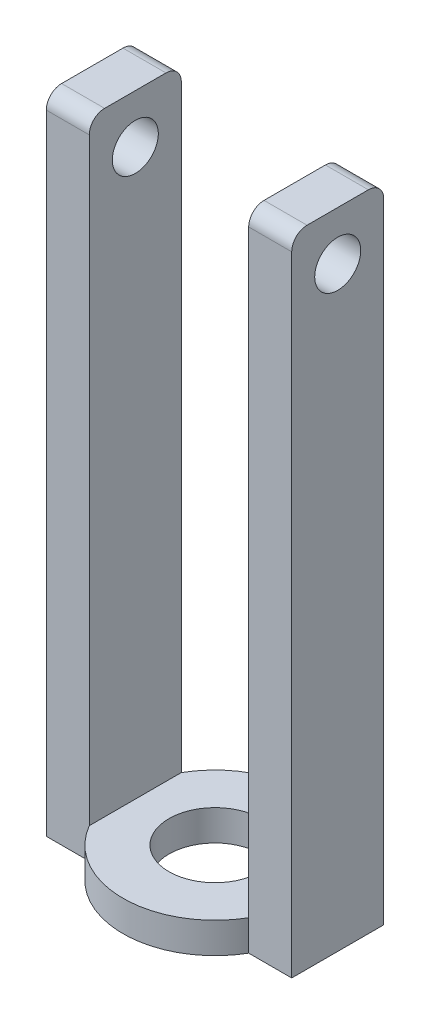
ISO-10303-21;
HEADER;
FILE_DESCRIPTION(('STEP AP214'),'2;1');
FILE_NAME('part.step','',(''),(''),'','','');
FILE_SCHEMA(('AUTOMOTIVE_DESIGN { 1 0 10303 214 1 1 1 1 }'));
ENDSEC;
DATA;
#1=APPLICATION_CONTEXT('core data for automotive mechanical design processes');
#2=APPLICATION_PROTOCOL_DEFINITION('international standard','automotive_design',2000,#1);
#3=PRODUCT_CONTEXT('',#1,'mechanical');
#4=PRODUCT('Part','Part','',(#3));
#5=PRODUCT_RELATED_PRODUCT_CATEGORY('part','',(#4));
#6=PRODUCT_DEFINITION_FORMATION('','',#4);
#7=PRODUCT_DEFINITION_CONTEXT('part definition',#1,'design');
#8=PRODUCT_DEFINITION('design','',#6,#7);
#9=PRODUCT_DEFINITION_SHAPE('','',#8);
#10=(LENGTH_UNIT() NAMED_UNIT(*) SI_UNIT(.MILLI.,.METRE.));
#11=(NAMED_UNIT(*) PLANE_ANGLE_UNIT() SI_UNIT($,.RADIAN.));
#12=(NAMED_UNIT(*) SI_UNIT($,.STERADIAN.) SOLID_ANGLE_UNIT());
#13=UNCERTAINTY_MEASURE_WITH_UNIT(LENGTH_MEASURE(1.E-05),#10,'distance_accuracy_value','');
#14=(GEOMETRIC_REPRESENTATION_CONTEXT(3) GLOBAL_UNCERTAINTY_ASSIGNED_CONTEXT((#13)) GLOBAL_UNIT_ASSIGNED_CONTEXT((#10,
#11,#12)) REPRESENTATION_CONTEXT('',''));
#15=CARTESIAN_POINT('',(0.,0.,0.));
#16=DIRECTION('',(0.,0.,1.));
#17=DIRECTION('',(1.,0.,0.));
#18=AXIS2_PLACEMENT_3D('',#15,#16,#17);
#19=CARTESIAN_POINT('',(0.,100.,0.));
#20=DIRECTION('',(0.,1.,0.));
#21=DIRECTION('',(0.,0.,1.));
#22=AXIS2_PLACEMENT_3D('',#19,#20,#21);
#23=PLANE('',#22);
#24=CARTESIAN_POINT('',(0.,100.,0.));
#25=DIRECTION('',(0.,1.,0.));
#26=DIRECTION('',(0.,0.,1.));
#27=AXIS2_PLACEMENT_3D('',#24,#25,#26);
#28=CIRCLE('',#27,150.);
#29=CARTESIAN_POINT('',(0.,100.,150.));
#30=VERTEX_POINT('',#29);
#31=EDGE_CURVE('E350',#30,#30,#28,.T.);
#32=ORIENTED_EDGE('',*,*,#31,.F.);
#33=EDGE_LOOP('',(#32));
#34=FACE_BOUND('',#33,.T.);
#35=CARTESIAN_POINT('',(0.,100.,0.));
#36=DIRECTION('',(0.,1.,0.));
#37=DIRECTION('',(0.,0.,1.));
#38=AXIS2_PLACEMENT_3D('',#35,#36,#37);
#39=CIRCLE('',#38,300.);
#40=CARTESIAN_POINT('',(-259.807621135332,100.,150.));
#41=VERTEX_POINT('',#40);
#42=CARTESIAN_POINT('',(259.807621135332,100.,150.));
#43=VERTEX_POINT('',#42);
#44=EDGE_CURVE('E159',#41,#43,#39,.T.);
#45=ORIENTED_EDGE('',*,*,#44,.T.);
#46=DIRECTION('',(0.,0.,1.));
#47=VECTOR('',#46,1.);
#48=CARTESIAN_POINT('',(259.807621135332,100.,-150.));
#49=LINE('',#48,#47);
#50=CARTESIAN_POINT('',(259.807621135332,100.,-150.));
#51=VERTEX_POINT('',#50);
#52=EDGE_CURVE('E148',#51,#43,#49,.T.);
#53=ORIENTED_EDGE('',*,*,#52,.F.);
#54=CARTESIAN_POINT('',(0.,100.,0.));
#55=DIRECTION('',(0.,1.,0.));
#56=DIRECTION('',(0.,0.,1.));
#57=AXIS2_PLACEMENT_3D('',#54,#55,#56);
#58=CIRCLE('',#57,300.);
#59=CARTESIAN_POINT('',(-259.807621135332,100.,-150.));
#60=VERTEX_POINT('',#59);
#61=EDGE_CURVE('E165',#51,#60,#58,.T.);
#62=ORIENTED_EDGE('',*,*,#61,.T.);
#63=DIRECTION('',(0.,0.,1.));
#64=VECTOR('',#63,1.);
#65=CARTESIAN_POINT('',(-259.807621135332,100.,-150.));
#66=LINE('',#65,#64);
#67=EDGE_CURVE('E154',#60,#41,#66,.T.);
#68=ORIENTED_EDGE('',*,*,#67,.T.);
#69=EDGE_LOOP('',(#45,#53,#62,#68));
#70=FACE_BOUND('',#69,.T.);
#71=ADVANCED_FACE('F34',(#34,#70),#23,.T.);
#72=CARTESIAN_POINT('',(0.,100.,0.));
#73=DIRECTION('',(0.,-1.,0.));
#74=DIRECTION('',(0.,0.,-1.));
#75=AXIS2_PLACEMENT_3D('',#72,#73,#74);
#76=CYLINDRICAL_SURFACE('',#75,300.);
#77=CARTESIAN_POINT('',(0.,0.,0.));
#78=DIRECTION('',(0.,1.,0.));
#79=DIRECTION('',(0.,0.,1.));
#80=AXIS2_PLACEMENT_3D('',#77,#78,#79);
#81=CIRCLE('',#80,300.);
#82=CARTESIAN_POINT('',(259.807621135332,0.,-150.));
#83=VERTEX_POINT('',#82);
#84=CARTESIAN_POINT('',(-259.807621135332,0.,-150.));
#85=VERTEX_POINT('',#84);
#86=EDGE_CURVE('E321',#83,#85,#81,.T.);
#87=ORIENTED_EDGE('',*,*,#86,.T.);
#88=DIRECTION('',(0.,-1.,0.));
#89=VECTOR('',#88,1.);
#90=CARTESIAN_POINT('',(-259.807621135332,100.,-150.));
#91=LINE('',#90,#89);
#92=EDGE_CURVE('E182',#60,#85,#91,.T.);
#93=ORIENTED_EDGE('',*,*,#92,.F.);
#94=ORIENTED_EDGE('',*,*,#61,.F.);
#95=DIRECTION('',(0.,-1.,0.));
#96=VECTOR('',#95,1.);
#97=CARTESIAN_POINT('',(259.807621135332,100.,-150.));
#98=LINE('',#97,#96);
#99=EDGE_CURVE('E164',#51,#83,#98,.T.);
#100=ORIENTED_EDGE('',*,*,#99,.T.);
#101=EDGE_LOOP('',(#87,#93,#94,#100));
#102=FACE_BOUND('',#101,.T.);
#103=ADVANCED_FACE('F257',(#102),#76,.T.);
#104=CARTESIAN_POINT('',(0.,100.,-150.));
#105=DIRECTION('',(0.,0.,-1.));
#106=DIRECTION('',(-1.,0.,0.));
#107=AXIS2_PLACEMENT_3D('',#104,#105,#106);
#108=PLANE('',#107);
#109=DIRECTION('',(0.,-1.,0.));
#110=VECTOR('',#109,1.);
#111=CARTESIAN_POINT('',(-400.,100.,-150.));
#112=LINE('',#111,#110);
#113=CARTESIAN_POINT('',(-400.,2050.,-150.));
#114=VERTEX_POINT('',#113);
#115=CARTESIAN_POINT('',(-400.,0.,-150.));
#116=VERTEX_POINT('',#115);
#117=EDGE_CURVE('E180',#114,#116,#112,.T.);
#118=ORIENTED_EDGE('',*,*,#117,.F.);
#119=DIRECTION('',(1.,0.,0.));
#120=VECTOR('',#119,1.);
#121=CARTESIAN_POINT('',(-259.807621135332,2050.,-150.));
#122=LINE('',#121,#120);
#123=CARTESIAN_POINT('',(-259.807621135332,2050.,-150.));
#124=VERTEX_POINT('',#123);
#125=EDGE_CURVE('E199',#114,#124,#122,.T.);
#126=ORIENTED_EDGE('',*,*,#125,.T.);
#127=DIRECTION('',(0.,-1.,0.));
#128=VECTOR('',#127,1.);
#129=CARTESIAN_POINT('',(-259.807621135332,2100.,-150.));
#130=LINE('',#129,#128);
#131=EDGE_CURVE('E340',#124,#60,#130,.T.);
#132=ORIENTED_EDGE('',*,*,#131,.T.);
#133=ORIENTED_EDGE('',*,*,#92,.T.);
#134=DIRECTION('',(1.,0.,0.));
#135=VECTOR('',#134,1.);
#136=CARTESIAN_POINT('',(0.,0.,-150.));
#137=LINE('',#136,#135);
#138=EDGE_CURVE('E317',#116,#85,#137,.T.);
#139=ORIENTED_EDGE('',*,*,#138,.F.);
#140=EDGE_LOOP('',(#118,#126,#132,#133,#139));
#141=FACE_BOUND('',#140,.T.);
#142=ADVANCED_FACE('F263',(#141),#108,.T.);
#143=CARTESIAN_POINT('',(-400.,100.,0.));
#144=DIRECTION('',(1.,0.,0.));
#145=DIRECTION('',(0.,0.,-1.));
#146=AXIS2_PLACEMENT_3D('',#143,#144,#145);
#147=PLANE('',#146);
#148=CARTESIAN_POINT('',(-400.,1941.16,0.));
#149=DIRECTION('',(-1.,0.,0.));
#150=DIRECTION('',(0.,0.,1.));
#151=AXIS2_PLACEMENT_3D('',#148,#149,#150);
#152=CIRCLE('',#151,75.);
#153=CARTESIAN_POINT('',(-400.,1941.16,75.));
#154=VERTEX_POINT('',#153);
#155=EDGE_CURVE('E358',#154,#154,#152,.T.);
#156=ORIENTED_EDGE('',*,*,#155,.F.);
#157=EDGE_LOOP('',(#156));
#158=FACE_BOUND('',#157,.T.);
#159=DIRECTION('',(0.,-1.,0.));
#160=VECTOR('',#159,1.);
#161=CARTESIAN_POINT('',(-400.,100.,150.));
#162=LINE('',#161,#160);
#163=CARTESIAN_POINT('',(-400.,2050.,150.));
#164=VERTEX_POINT('',#163);
#165=CARTESIAN_POINT('',(-400.,0.,150.));
#166=VERTEX_POINT('',#165);
#167=EDGE_CURVE('E173',#164,#166,#162,.T.);
#168=ORIENTED_EDGE('',*,*,#167,.F.);
#169=CARTESIAN_POINT('',(-400.,2050.,100.));
#170=DIRECTION('',(1.,0.,0.));
#171=DIRECTION('',(0.,0.,-1.));
#172=AXIS2_PLACEMENT_3D('',#169,#170,#171);
#173=CIRCLE('',#172,50.);
#174=CARTESIAN_POINT('',(-400.,2100.,100.));
#175=VERTEX_POINT('',#174);
#176=EDGE_CURVE('E197',#164,#175,#173,.F.);
#177=ORIENTED_EDGE('',*,*,#176,.T.);
#178=DIRECTION('',(0.,0.,1.));
#179=VECTOR('',#178,1.);
#180=CARTESIAN_POINT('',(-400.,2100.,-150.));
#181=LINE('',#180,#179);
#182=CARTESIAN_POINT('',(-400.,2100.,-100.));
#183=VERTEX_POINT('',#182);
#184=EDGE_CURVE('E313',#183,#175,#181,.T.);
#185=ORIENTED_EDGE('',*,*,#184,.F.);
#186=CARTESIAN_POINT('',(-400.,2050.,-100.));
#187=DIRECTION('',(1.,0.,0.));
#188=DIRECTION('',(0.,0.,-1.));
#189=AXIS2_PLACEMENT_3D('',#186,#187,#188);
#190=CIRCLE('',#189,50.);
#191=EDGE_CURVE('E195',#183,#114,#190,.F.);
#192=ORIENTED_EDGE('',*,*,#191,.T.);
#193=ORIENTED_EDGE('',*,*,#117,.T.);
#194=DIRECTION('',(0.,0.,1.));
#195=VECTOR('',#194,1.);
#196=CARTESIAN_POINT('',(-400.,0.,0.));
#197=LINE('',#196,#195);
#198=EDGE_CURVE('E320',#116,#166,#197,.T.);
#199=ORIENTED_EDGE('',*,*,#198,.T.);
#200=EDGE_LOOP('',(#168,#177,#185,#192,#193,#199));
#201=FACE_BOUND('',#200,.T.);
#202=ADVANCED_FACE('F286',(#158,#201),#147,.F.);
#203=CARTESIAN_POINT('',(0.,100.,150.));
#204=DIRECTION('',(0.,0.,-1.));
#205=DIRECTION('',(-1.,0.,0.));
#206=AXIS2_PLACEMENT_3D('',#203,#204,#205);
#207=PLANE('',#206);
#208=DIRECTION('',(0.,-1.,0.));
#209=VECTOR('',#208,1.);
#210=CARTESIAN_POINT('',(-259.807621135332,2100.,150.));
#211=LINE('',#210,#209);
#212=CARTESIAN_POINT('',(-259.807621135332,2050.,150.));
#213=VERTEX_POINT('',#212);
#214=EDGE_CURVE('E325',#213,#41,#211,.T.);
#215=ORIENTED_EDGE('',*,*,#214,.F.);
#216=DIRECTION('',(1.,0.,0.));
#217=VECTOR('',#216,1.);
#218=CARTESIAN_POINT('',(0.,2050.,150.));
#219=LINE('',#218,#217);
#220=EDGE_CURVE('E193',#213,#164,#219,.F.);
#221=ORIENTED_EDGE('',*,*,#220,.T.);
#222=ORIENTED_EDGE('',*,*,#167,.T.);
#223=DIRECTION('',(1.,0.,0.));
#224=VECTOR('',#223,1.);
#225=CARTESIAN_POINT('',(0.,0.,150.));
#226=LINE('',#225,#224);
#227=CARTESIAN_POINT('',(-259.807621135332,0.,150.));
#228=VERTEX_POINT('',#227);
#229=EDGE_CURVE('E323',#166,#228,#226,.T.);
#230=ORIENTED_EDGE('',*,*,#229,.T.);
#231=DIRECTION('',(0.,-1.,0.));
#232=VECTOR('',#231,1.);
#233=CARTESIAN_POINT('',(-259.807621135332,100.,150.));
#234=LINE('',#233,#232);
#235=EDGE_CURVE('E170',#41,#228,#234,.T.);
#236=ORIENTED_EDGE('',*,*,#235,.F.);
#237=EDGE_LOOP('',(#215,#221,#222,#230,#236));
#238=FACE_BOUND('',#237,.T.);
#239=ADVANCED_FACE('F283',(#238),#207,.F.);
#240=CARTESIAN_POINT('',(0.,100.,0.));
#241=DIRECTION('',(0.,-1.,0.));
#242=DIRECTION('',(0.,0.,-1.));
#243=AXIS2_PLACEMENT_3D('',#240,#241,#242);
#244=CYLINDRICAL_SURFACE('',#243,300.);
#245=CARTESIAN_POINT('',(0.,0.,0.));
#246=DIRECTION('',(0.,1.,0.));
#247=DIRECTION('',(0.,0.,1.));
#248=AXIS2_PLACEMENT_3D('',#245,#246,#247);
#249=CIRCLE('',#248,300.);
#250=CARTESIAN_POINT('',(259.807621135332,0.,150.));
#251=VERTEX_POINT('',#250);
#252=EDGE_CURVE('E169',#228,#251,#249,.T.);
#253=ORIENTED_EDGE('',*,*,#252,.T.);
#254=DIRECTION('',(0.,-1.,0.));
#255=VECTOR('',#254,1.);
#256=CARTESIAN_POINT('',(259.807621135332,100.,150.));
#257=LINE('',#256,#255);
#258=EDGE_CURVE('E141',#43,#251,#257,.T.);
#259=ORIENTED_EDGE('',*,*,#258,.F.);
#260=ORIENTED_EDGE('',*,*,#44,.F.);
#261=ORIENTED_EDGE('',*,*,#235,.T.);
#262=EDGE_LOOP('',(#253,#259,#260,#261));
#263=FACE_BOUND('',#262,.T.);
#264=ADVANCED_FACE('F167',(#263),#244,.T.);
#265=CARTESIAN_POINT('',(0.,100.,150.));
#266=DIRECTION('',(0.,0.,-1.));
#267=DIRECTION('',(-1.,0.,0.));
#268=AXIS2_PLACEMENT_3D('',#265,#266,#267);
#269=PLANE('',#268);
#270=DIRECTION('',(0.,-1.,0.));
#271=VECTOR('',#270,1.);
#272=CARTESIAN_POINT('',(400.,100.,150.));
#273=LINE('',#272,#271);
#274=CARTESIAN_POINT('',(400.,2050.,150.));
#275=VERTEX_POINT('',#274);
#276=CARTESIAN_POINT('',(400.,0.,150.));
#277=VERTEX_POINT('',#276);
#278=EDGE_CURVE('E171',#275,#277,#273,.T.);
#279=ORIENTED_EDGE('',*,*,#278,.F.);
#280=DIRECTION('',(1.,0.,0.));
#281=VECTOR('',#280,1.);
#282=CARTESIAN_POINT('',(0.,2050.,150.));
#283=LINE('',#282,#281);
#284=CARTESIAN_POINT('',(259.807621135332,2050.,150.));
#285=VERTEX_POINT('',#284);
#286=EDGE_CURVE('E58',#275,#285,#283,.F.);
#287=ORIENTED_EDGE('',*,*,#286,.T.);
#288=DIRECTION('',(0.,-1.,0.));
#289=VECTOR('',#288,1.);
#290=CARTESIAN_POINT('',(259.807621135332,2100.,150.));
#291=LINE('',#290,#289);
#292=EDGE_CURVE('E136',#285,#43,#291,.T.);
#293=ORIENTED_EDGE('',*,*,#292,.T.);
#294=ORIENTED_EDGE('',*,*,#258,.T.);
#295=DIRECTION('',(1.,0.,0.));
#296=VECTOR('',#295,1.);
#297=CARTESIAN_POINT('',(0.,0.,150.));
#298=LINE('',#297,#296);
#299=EDGE_CURVE('E226',#251,#277,#298,.T.);
#300=ORIENTED_EDGE('',*,*,#299,.T.);
#301=EDGE_LOOP('',(#279,#287,#293,#294,#300));
#302=FACE_BOUND('',#301,.T.);
#303=ADVANCED_FACE('F138',(#302),#269,.F.);
#304=CARTESIAN_POINT('',(400.,100.,0.));
#305=DIRECTION('',(1.,0.,0.));
#306=DIRECTION('',(0.,0.,-1.));
#307=AXIS2_PLACEMENT_3D('',#304,#305,#306);
#308=PLANE('',#307);
#309=CARTESIAN_POINT('',(400.,1941.16,0.));
#310=DIRECTION('',(-1.,0.,0.));
#311=DIRECTION('',(0.,0.,1.));
#312=AXIS2_PLACEMENT_3D('',#309,#310,#311);
#313=CIRCLE('',#312,75.);
#314=CARTESIAN_POINT('',(400.,1941.16,75.));
#315=VERTEX_POINT('',#314);
#316=EDGE_CURVE('E361',#315,#315,#313,.T.);
#317=ORIENTED_EDGE('',*,*,#316,.T.);
#318=EDGE_LOOP('',(#317));
#319=FACE_BOUND('',#318,.T.);
#320=DIRECTION('',(0.,0.,1.));
#321=VECTOR('',#320,1.);
#322=CARTESIAN_POINT('',(400.,2100.,-150.));
#323=LINE('',#322,#321);
#324=CARTESIAN_POINT('',(400.,2100.,-100.));
#325=VERTEX_POINT('',#324);
#326=CARTESIAN_POINT('',(400.,2100.,100.));
#327=VERTEX_POINT('',#326);
#328=EDGE_CURVE('E155',#325,#327,#323,.T.);
#329=ORIENTED_EDGE('',*,*,#328,.T.);
#330=CARTESIAN_POINT('',(400.,2050.,100.));
#331=DIRECTION('',(1.,0.,0.));
#332=DIRECTION('',(0.,0.,-1.));
#333=AXIS2_PLACEMENT_3D('',#330,#331,#332);
#334=CIRCLE('',#333,50.);
#335=EDGE_CURVE('E209',#327,#275,#334,.T.);
#336=ORIENTED_EDGE('',*,*,#335,.T.);
#337=ORIENTED_EDGE('',*,*,#278,.T.);
#338=DIRECTION('',(0.,0.,1.));
#339=VECTOR('',#338,1.);
#340=CARTESIAN_POINT('',(400.,0.,0.));
#341=LINE('',#340,#339);
#342=CARTESIAN_POINT('',(400.,0.,-150.));
#343=VERTEX_POINT('',#342);
#344=EDGE_CURVE('E229',#343,#277,#341,.T.);
#345=ORIENTED_EDGE('',*,*,#344,.F.);
#346=DIRECTION('',(0.,-1.,0.));
#347=VECTOR('',#346,1.);
#348=CARTESIAN_POINT('',(400.,100.,-150.));
#349=LINE('',#348,#347);
#350=CARTESIAN_POINT('',(400.,2050.,-150.));
#351=VERTEX_POINT('',#350);
#352=EDGE_CURVE('E175',#351,#343,#349,.T.);
#353=ORIENTED_EDGE('',*,*,#352,.F.);
#354=CARTESIAN_POINT('',(400.,2050.,-100.));
#355=DIRECTION('',(1.,0.,0.));
#356=DIRECTION('',(0.,0.,-1.));
#357=AXIS2_PLACEMENT_3D('',#354,#355,#356);
#358=CIRCLE('',#357,50.);
#359=EDGE_CURVE('E207',#351,#325,#358,.T.);
#360=ORIENTED_EDGE('',*,*,#359,.T.);
#361=EDGE_LOOP('',(#329,#336,#337,#345,#353,#360));
#362=FACE_BOUND('',#361,.T.);
#363=ADVANCED_FACE('F224',(#319,#362),#308,.T.);
#364=CARTESIAN_POINT('',(0.,100.,-150.));
#365=DIRECTION('',(0.,0.,-1.));
#366=DIRECTION('',(-1.,0.,0.));
#367=AXIS2_PLACEMENT_3D('',#364,#365,#366);
#368=PLANE('',#367);
#369=DIRECTION('',(0.,-1.,0.));
#370=VECTOR('',#369,1.);
#371=CARTESIAN_POINT('',(259.807621135332,2100.,-150.));
#372=LINE('',#371,#370);
#373=CARTESIAN_POINT('',(259.807621135332,2050.,-150.));
#374=VERTEX_POINT('',#373);
#375=EDGE_CURVE('E145',#374,#51,#372,.T.);
#376=ORIENTED_EDGE('',*,*,#375,.F.);
#377=DIRECTION('',(1.,0.,0.));
#378=VECTOR('',#377,1.);
#379=CARTESIAN_POINT('',(400.,2050.,-150.));
#380=LINE('',#379,#378);
#381=EDGE_CURVE('E11',#374,#351,#380,.T.);
#382=ORIENTED_EDGE('',*,*,#381,.T.);
#383=ORIENTED_EDGE('',*,*,#352,.T.);
#384=DIRECTION('',(1.,0.,0.));
#385=VECTOR('',#384,1.);
#386=CARTESIAN_POINT('',(0.,0.,-150.));
#387=LINE('',#386,#385);
#388=EDGE_CURVE('E235',#83,#343,#387,.T.);
#389=ORIENTED_EDGE('',*,*,#388,.F.);
#390=ORIENTED_EDGE('',*,*,#99,.F.);
#391=EDGE_LOOP('',(#376,#382,#383,#389,#390));
#392=FACE_BOUND('',#391,.T.);
#393=ADVANCED_FACE('F242',(#392),#368,.T.);
#394=CARTESIAN_POINT('',(0.,0.,0.));
#395=DIRECTION('',(0.,1.,0.));
#396=DIRECTION('',(0.,0.,1.));
#397=AXIS2_PLACEMENT_3D('',#394,#395,#396);
#398=PLANE('',#397);
#399=CARTESIAN_POINT('',(0.,0.,0.));
#400=DIRECTION('',(0.,1.,0.));
#401=DIRECTION('',(0.,0.,1.));
#402=AXIS2_PLACEMENT_3D('',#399,#400,#401);
#403=CIRCLE('',#402,150.);
#404=CARTESIAN_POINT('',(0.,0.,150.));
#405=VERTEX_POINT('',#404);
#406=EDGE_CURVE('E347',#405,#405,#403,.T.);
#407=ORIENTED_EDGE('',*,*,#406,.T.);
#408=EDGE_LOOP('',(#407));
#409=FACE_BOUND('',#408,.T.);
#410=ORIENTED_EDGE('',*,*,#86,.F.);
#411=ORIENTED_EDGE('',*,*,#388,.T.);
#412=ORIENTED_EDGE('',*,*,#344,.T.);
#413=ORIENTED_EDGE('',*,*,#299,.F.);
#414=ORIENTED_EDGE('',*,*,#252,.F.);
#415=ORIENTED_EDGE('',*,*,#229,.F.);
#416=ORIENTED_EDGE('',*,*,#198,.F.);
#417=ORIENTED_EDGE('',*,*,#138,.T.);
#418=EDGE_LOOP('',(#410,#411,#412,#413,#414,#415,#416,#417));
#419=FACE_BOUND('',#418,.T.);
#420=ADVANCED_FACE('F233',(#409,#419),#398,.F.);
#421=CARTESIAN_POINT('',(-259.807621135332,2100.,-150.));
#422=DIRECTION('',(1.,0.,0.));
#423=DIRECTION('',(0.,0.,-1.));
#424=AXIS2_PLACEMENT_3D('',#421,#422,#423);
#425=PLANE('',#424);
#426=CARTESIAN_POINT('',(-259.807621135332,1941.16,0.));
#427=DIRECTION('',(1.,0.,0.));
#428=DIRECTION('',(0.,0.,-1.));
#429=AXIS2_PLACEMENT_3D('',#426,#427,#428);
#430=CIRCLE('',#429,75.);
#431=CARTESIAN_POINT('',(-259.807621135332,1941.16,75.));
#432=VERTEX_POINT('',#431);
#433=EDGE_CURVE('E354',#432,#432,#430,.T.);
#434=ORIENTED_EDGE('',*,*,#433,.F.);
#435=EDGE_LOOP('',(#434));
#436=FACE_BOUND('',#435,.T.);
#437=DIRECTION('',(0.,0.,1.));
#438=VECTOR('',#437,1.);
#439=CARTESIAN_POINT('',(-259.807621135332,2100.,-150.));
#440=LINE('',#439,#438);
#441=CARTESIAN_POINT('',(-259.807621135332,2100.,-100.));
#442=VERTEX_POINT('',#441);
#443=CARTESIAN_POINT('',(-259.807621135332,2100.,100.));
#444=VERTEX_POINT('',#443);
#445=EDGE_CURVE('E337',#442,#444,#440,.T.);
#446=ORIENTED_EDGE('',*,*,#445,.T.);
#447=CARTESIAN_POINT('',(-259.807621135332,2050.,100.));
#448=DIRECTION('',(1.,0.,0.));
#449=DIRECTION('',(0.,0.,-1.));
#450=AXIS2_PLACEMENT_3D('',#447,#448,#449);
#451=CIRCLE('',#450,50.);
#452=EDGE_CURVE('E191',#444,#213,#451,.T.);
#453=ORIENTED_EDGE('',*,*,#452,.T.);
#454=ORIENTED_EDGE('',*,*,#214,.T.);
#455=ORIENTED_EDGE('',*,*,#67,.F.);
#456=ORIENTED_EDGE('',*,*,#131,.F.);
#457=CARTESIAN_POINT('',(-259.807621135332,2050.,-100.));
#458=DIRECTION('',(1.,0.,0.));
#459=DIRECTION('',(0.,0.,-1.));
#460=AXIS2_PLACEMENT_3D('',#457,#458,#459);
#461=CIRCLE('',#460,50.);
#462=EDGE_CURVE('E189',#124,#442,#461,.T.);
#463=ORIENTED_EDGE('',*,*,#462,.T.);
#464=EDGE_LOOP('',(#446,#453,#454,#455,#456,#463));
#465=FACE_BOUND('',#464,.T.);
#466=ADVANCED_FACE('F269',(#436,#465),#425,.T.);
#467=CARTESIAN_POINT('',(0.,2100.,0.));
#468=DIRECTION('',(0.,-1.,0.));
#469=DIRECTION('',(0.,0.,-1.));
#470=AXIS2_PLACEMENT_3D('',#467,#468,#469);
#471=PLANE('',#470);
#472=ORIENTED_EDGE('',*,*,#184,.T.);
#473=DIRECTION('',(1.,0.,0.));
#474=VECTOR('',#473,1.);
#475=CARTESIAN_POINT('',(0.,2100.,100.));
#476=LINE('',#475,#474);
#477=EDGE_CURVE('E186',#175,#444,#476,.T.);
#478=ORIENTED_EDGE('',*,*,#477,.T.);
#479=ORIENTED_EDGE('',*,*,#445,.F.);
#480=DIRECTION('',(1.,0.,0.));
#481=VECTOR('',#480,1.);
#482=CARTESIAN_POINT('',(-400.,2100.,-100.));
#483=LINE('',#482,#481);
#484=EDGE_CURVE('E184',#442,#183,#483,.F.);
#485=ORIENTED_EDGE('',*,*,#484,.T.);
#486=EDGE_LOOP('',(#472,#478,#479,#485));
#487=FACE_BOUND('',#486,.T.);
#488=ADVANCED_FACE('F336',(#487),#471,.F.);
#489=CARTESIAN_POINT('',(259.807621135332,2100.,-150.));
#490=DIRECTION('',(1.,0.,0.));
#491=DIRECTION('',(0.,0.,-1.));
#492=AXIS2_PLACEMENT_3D('',#489,#490,#491);
#493=PLANE('',#492);
#494=CARTESIAN_POINT('',(259.807621135332,1941.16,0.));
#495=DIRECTION('',(1.,0.,0.));
#496=DIRECTION('',(0.,0.,-1.));
#497=AXIS2_PLACEMENT_3D('',#494,#495,#496);
#498=CIRCLE('',#497,75.);
#499=CARTESIAN_POINT('',(259.807621135332,1941.16,75.));
#500=VERTEX_POINT('',#499);
#501=EDGE_CURVE('E38',#500,#500,#498,.T.);
#502=ORIENTED_EDGE('',*,*,#501,.T.);
#503=EDGE_LOOP('',(#502));
#504=FACE_BOUND('',#503,.T.);
#505=ORIENTED_EDGE('',*,*,#292,.F.);
#506=CARTESIAN_POINT('',(259.807621135332,2050.,100.));
#507=DIRECTION('',(1.,0.,0.));
#508=DIRECTION('',(0.,0.,-1.));
#509=AXIS2_PLACEMENT_3D('',#506,#507,#508);
#510=CIRCLE('',#509,50.);
#511=CARTESIAN_POINT('',(259.807621135332,2100.,100.));
#512=VERTEX_POINT('',#511);
#513=EDGE_CURVE('E43',#285,#512,#510,.F.);
#514=ORIENTED_EDGE('',*,*,#513,.T.);
#515=DIRECTION('',(0.,0.,1.));
#516=VECTOR('',#515,1.);
#517=CARTESIAN_POINT('',(259.807621135332,2100.,-150.));
#518=LINE('',#517,#516);
#519=CARTESIAN_POINT('',(259.807621135332,2100.,-100.));
#520=VERTEX_POINT('',#519);
#521=EDGE_CURVE('E144',#520,#512,#518,.T.);
#522=ORIENTED_EDGE('',*,*,#521,.F.);
#523=CARTESIAN_POINT('',(259.807621135332,2050.,-100.));
#524=DIRECTION('',(1.,0.,0.));
#525=DIRECTION('',(0.,0.,-1.));
#526=AXIS2_PLACEMENT_3D('',#523,#524,#525);
#527=CIRCLE('',#526,50.);
#528=EDGE_CURVE('E50',#520,#374,#527,.F.);
#529=ORIENTED_EDGE('',*,*,#528,.T.);
#530=ORIENTED_EDGE('',*,*,#375,.T.);
#531=ORIENTED_EDGE('',*,*,#52,.T.);
#532=EDGE_LOOP('',(#505,#514,#522,#529,#530,#531));
#533=FACE_BOUND('',#532,.T.);
#534=ADVANCED_FACE('F150',(#504,#533),#493,.F.);
#535=CARTESIAN_POINT('',(0.,2100.,0.));
#536=DIRECTION('',(0.,-1.,0.));
#537=DIRECTION('',(0.,0.,-1.));
#538=AXIS2_PLACEMENT_3D('',#535,#536,#537);
#539=PLANE('',#538);
#540=ORIENTED_EDGE('',*,*,#521,.T.);
#541=DIRECTION('',(1.,0.,0.));
#542=VECTOR('',#541,1.);
#543=CARTESIAN_POINT('',(0.,2100.,100.));
#544=LINE('',#543,#542);
#545=EDGE_CURVE('E204',#512,#327,#544,.T.);
#546=ORIENTED_EDGE('',*,*,#545,.T.);
#547=ORIENTED_EDGE('',*,*,#328,.F.);
#548=DIRECTION('',(1.,0.,0.));
#549=VECTOR('',#548,1.);
#550=CARTESIAN_POINT('',(259.807621135332,2100.,-100.));
#551=LINE('',#550,#549);
#552=EDGE_CURVE('E202',#325,#520,#551,.F.);
#553=ORIENTED_EDGE('',*,*,#552,.T.);
#554=EDGE_LOOP('',(#540,#546,#547,#553));
#555=FACE_BOUND('',#554,.T.);
#556=ADVANCED_FACE('F217',(#555),#539,.F.);
#557=CARTESIAN_POINT('',(0.,0.,0.));
#558=DIRECTION('',(0.,1.,0.));
#559=DIRECTION('',(0.,0.,1.));
#560=AXIS2_PLACEMENT_3D('',#557,#558,#559);
#561=CYLINDRICAL_SURFACE('',#560,150.);
#562=ORIENTED_EDGE('',*,*,#406,.F.);
#563=EDGE_LOOP('',(#562));
#564=FACE_BOUND('',#563,.T.);
#565=ORIENTED_EDGE('',*,*,#31,.T.);
#566=EDGE_LOOP('',(#565));
#567=FACE_BOUND('',#566,.T.);
#568=ADVANCED_FACE('F297',(#564,#567),#561,.F.);
#569=CARTESIAN_POINT('',(0.,2050.,100.));
#570=DIRECTION('',(1.,0.,0.));
#571=DIRECTION('',(0.,0.,-1.));
#572=AXIS2_PLACEMENT_3D('',#569,#570,#571);
#573=CYLINDRICAL_SURFACE('',#572,50.);
#574=ORIENTED_EDGE('',*,*,#176,.F.);
#575=ORIENTED_EDGE('',*,*,#220,.F.);
#576=ORIENTED_EDGE('',*,*,#452,.F.);
#577=ORIENTED_EDGE('',*,*,#477,.F.);
#578=EDGE_LOOP('',(#574,#575,#576,#577));
#579=FACE_BOUND('',#578,.T.);
#580=ADVANCED_FACE('F294',(#579),#573,.T.);
#581=CARTESIAN_POINT('',(0.,2050.,-100.));
#582=DIRECTION('',(-1.,0.,0.));
#583=DIRECTION('',(0.,0.,1.));
#584=AXIS2_PLACEMENT_3D('',#581,#582,#583);
#585=CYLINDRICAL_SURFACE('',#584,50.);
#586=ORIENTED_EDGE('',*,*,#191,.F.);
#587=ORIENTED_EDGE('',*,*,#484,.F.);
#588=ORIENTED_EDGE('',*,*,#462,.F.);
#589=ORIENTED_EDGE('',*,*,#125,.F.);
#590=EDGE_LOOP('',(#586,#587,#588,#589));
#591=FACE_BOUND('',#590,.T.);
#592=ADVANCED_FACE('F255',(#591),#585,.T.);
#593=CARTESIAN_POINT('',(0.,2050.,100.));
#594=DIRECTION('',(1.,0.,0.));
#595=DIRECTION('',(0.,0.,-1.));
#596=AXIS2_PLACEMENT_3D('',#593,#594,#595);
#597=CYLINDRICAL_SURFACE('',#596,50.);
#598=ORIENTED_EDGE('',*,*,#513,.F.);
#599=ORIENTED_EDGE('',*,*,#286,.F.);
#600=ORIENTED_EDGE('',*,*,#335,.F.);
#601=ORIENTED_EDGE('',*,*,#545,.F.);
#602=EDGE_LOOP('',(#598,#599,#600,#601));
#603=FACE_BOUND('',#602,.T.);
#604=ADVANCED_FACE('F222',(#603),#597,.T.);
#605=CARTESIAN_POINT('',(0.,2050.,-100.));
#606=DIRECTION('',(-1.,0.,0.));
#607=DIRECTION('',(0.,0.,1.));
#608=AXIS2_PLACEMENT_3D('',#605,#606,#607);
#609=CYLINDRICAL_SURFACE('',#608,50.);
#610=ORIENTED_EDGE('',*,*,#528,.F.);
#611=ORIENTED_EDGE('',*,*,#552,.F.);
#612=ORIENTED_EDGE('',*,*,#359,.F.);
#613=ORIENTED_EDGE('',*,*,#381,.F.);
#614=EDGE_LOOP('',(#610,#611,#612,#613));
#615=FACE_BOUND('',#614,.T.);
#616=ADVANCED_FACE('F36',(#615),#609,.T.);
#617=CARTESIAN_POINT('',(400.,1941.16,0.));
#618=DIRECTION('',(-1.,0.,0.));
#619=DIRECTION('',(0.,0.,1.));
#620=AXIS2_PLACEMENT_3D('',#617,#618,#619);
#621=CYLINDRICAL_SURFACE('',#620,75.);
#622=CARTESIAN_POINT('',(400.,1941.16,75.));
#623=CARTESIAN_POINT('',(398.53966272016,1941.16,75.));
#624=CARTESIAN_POINT('',(397.079325440319,1941.16,75.));
#625=CARTESIAN_POINT('',(394.158650880639,1941.16,75.));
#626=CARTESIAN_POINT('',(392.698313600798,1941.16,75.));
#627=CARTESIAN_POINT('',(389.777639041118,1941.16,75.));
#628=CARTESIAN_POINT('',(388.317301761278,1941.16,75.));
#629=CARTESIAN_POINT('',(385.396627201597,1941.16,75.));
#630=CARTESIAN_POINT('',(383.936289921757,1941.16,75.));
#631=CARTESIAN_POINT('',(381.015615362076,1941.16,75.));
#632=CARTESIAN_POINT('',(379.555278082236,1941.16,75.));
#633=CARTESIAN_POINT('',(376.634603522555,1941.16,75.));
#634=CARTESIAN_POINT('',(375.174266242715,1941.16,75.));
#635=CARTESIAN_POINT('',(372.253591683034,1941.16,75.));
#636=CARTESIAN_POINT('',(370.793254403194,1941.16,75.));
#637=CARTESIAN_POINT('',(367.872579843513,1941.16,75.));
#638=CARTESIAN_POINT('',(366.412242563673,1941.16,75.));
#639=CARTESIAN_POINT('',(363.491568003993,1941.16,75.));
#640=CARTESIAN_POINT('',(362.031230724152,1941.16,75.));
#641=CARTESIAN_POINT('',(359.110556164472,1941.16,75.));
#642=CARTESIAN_POINT('',(357.650218884631,1941.16,75.));
#643=CARTESIAN_POINT('',(354.729544324951,1941.16,75.));
#644=CARTESIAN_POINT('',(353.269207045111,1941.16,75.));
#645=CARTESIAN_POINT('',(350.34853248543,1941.16,75.));
#646=CARTESIAN_POINT('',(348.88819520559,1941.16,75.));
#647=CARTESIAN_POINT('',(345.967520645909,1941.16,75.));
#648=CARTESIAN_POINT('',(344.507183366069,1941.16,75.));
#649=CARTESIAN_POINT('',(341.586508806388,1941.16,75.));
#650=CARTESIAN_POINT('',(340.126171526548,1941.16,75.));
#651=CARTESIAN_POINT('',(337.205496966867,1941.16,75.));
#652=CARTESIAN_POINT('',(335.745159687027,1941.16,75.));
#653=CARTESIAN_POINT('',(332.824485127346,1941.16,75.));
#654=CARTESIAN_POINT('',(331.364147847506,1941.16,75.));
#655=CARTESIAN_POINT('',(328.443473287826,1941.16,75.));
#656=CARTESIAN_POINT('',(326.983136007985,1941.16,75.));
#657=CARTESIAN_POINT('',(324.062461448305,1941.16,75.));
#658=CARTESIAN_POINT('',(322.602124168464,1941.16,75.));
#659=CARTESIAN_POINT('',(319.681449608784,1941.16,75.));
#660=CARTESIAN_POINT('',(318.221112328943,1941.16,75.));
#661=CARTESIAN_POINT('',(315.300437769263,1941.16,75.));
#662=CARTESIAN_POINT('',(313.840100489423,1941.16,75.));
#663=CARTESIAN_POINT('',(310.919425929742,1941.16,75.));
#664=CARTESIAN_POINT('',(309.459088649902,1941.16,75.));
#665=CARTESIAN_POINT('',(306.538414090221,1941.16,75.));
#666=CARTESIAN_POINT('',(305.078076810381,1941.16,75.));
#667=CARTESIAN_POINT('',(302.1574022507,1941.16,75.));
#668=CARTESIAN_POINT('',(300.69706497086,1941.16,75.));
#669=CARTESIAN_POINT('',(297.776390411179,1941.16,75.));
#670=CARTESIAN_POINT('',(296.316053131339,1941.16,75.));
#671=CARTESIAN_POINT('',(293.395378571658,1941.16,75.));
#672=CARTESIAN_POINT('',(291.935041291818,1941.16,75.));
#673=CARTESIAN_POINT('',(289.014366732138,1941.16,75.));
#674=CARTESIAN_POINT('',(287.554029452297,1941.16,75.));
#675=CARTESIAN_POINT('',(284.633354892617,1941.16,75.));
#676=CARTESIAN_POINT('',(283.173017612776,1941.16,75.));
#677=CARTESIAN_POINT('',(280.252343053096,1941.16,75.));
#678=CARTESIAN_POINT('',(278.792005773256,1941.16,75.));
#679=CARTESIAN_POINT('',(275.871331213575,1941.16,75.));
#680=CARTESIAN_POINT('',(274.410993933735,1941.16,75.));
#681=CARTESIAN_POINT('',(271.490319374054,1941.16,75.));
#682=CARTESIAN_POINT('',(270.029982094214,1941.16,75.));
#683=CARTESIAN_POINT('',(267.109307534533,1941.16,75.));
#684=CARTESIAN_POINT('',(265.648970254693,1941.16,75.));
#685=CARTESIAN_POINT('',(262.728295695012,1941.16,75.));
#686=CARTESIAN_POINT('',(261.267958415172,1941.16,75.));
#687=CARTESIAN_POINT('',(259.807621135332,1941.16,75.));
#688=B_SPLINE_CURVE_WITH_KNOTS('',3,(#622,#623,#624,#625,#626,#627,#628,#629,#630,#631,#632,
#633,#634,#635,#636,#637,#638,#639,#640,#641,#642,#643,#644,#645,#646,#647,#648,#649,#650,#651,
#652,#653,#654,#655,#656,#657,#658,#659,#660,#661,#662,#663,#664,#665,#666,#667,#668,#669,#670,
#671,#672,#673,#674,#675,#676,#677,#678,#679,#680,#681,#682,#683,#684,#685,#686,#687),
.UNSPECIFIED.,.F.,.F.,(4,2,2,2,2,2,2,2,2,2,2,2,2,2,2,2,2,2,2,2,2,2,2,2,2,2,2,2,2,2,2,2,4),(0.,
4.38101183952089,8.76202367904177,13.1430355185627,17.5240473580835,21.9050591976044,
26.2860710371253,30.6670828766462,35.048094716167,39.4291065556879,43.8101183952088,
48.1911302347297,52.5721420742506,56.9531539137715,61.3341657532924,65.7151775928133,
70.0961894323341,74.477201271855,78.8582131113759,83.2392249508968,87.6202367904176,
92.0012486299385,96.3822604694594,100.76327230898,105.144284148501,109.525295988022,
113.906307827543,118.287319667064,122.668331506585,127.049343346106,131.430355185626,
135.811367025147,140.192378864668),.UNSPECIFIED.);
#689=EDGE_CURVE('BSEAM247',#315,#500,#688,.T.);
#690=ORIENTED_EDGE('',*,*,#316,.F.);
#691=ORIENTED_EDGE('',*,*,#501,.F.);
#692=ORIENTED_EDGE('',*,*,#689,.T.);
#693=ORIENTED_EDGE('',*,*,#689,.F.);
#694=EDGE_LOOP('',(#690,#692,#691,#693));
#695=FACE_BOUND('',#694,.T.);
#696=ADVANCED_FACE('F247',(#695),#621,.F.);
#697=CARTESIAN_POINT('',(-259.807621135332,1941.16,75.));
#698=CARTESIAN_POINT('',(-261.267958415172,1941.16,75.));
#699=CARTESIAN_POINT('',(-262.728295695012,1941.16,75.));
#700=CARTESIAN_POINT('',(-265.648970254693,1941.16,75.));
#701=CARTESIAN_POINT('',(-267.109307534533,1941.16,75.));
#702=CARTESIAN_POINT('',(-270.029982094214,1941.16,75.));
#703=CARTESIAN_POINT('',(-271.490319374054,1941.16,75.));
#704=CARTESIAN_POINT('',(-274.410993933735,1941.16,75.));
#705=CARTESIAN_POINT('',(-275.871331213575,1941.16,75.));
#706=CARTESIAN_POINT('',(-278.792005773256,1941.16,75.));
#707=CARTESIAN_POINT('',(-280.252343053096,1941.16,75.));
#708=CARTESIAN_POINT('',(-283.173017612777,1941.16,75.));
#709=CARTESIAN_POINT('',(-284.633354892617,1941.16,75.));
#710=CARTESIAN_POINT('',(-287.554029452297,1941.16,75.));
#711=CARTESIAN_POINT('',(-289.014366732138,1941.16,75.));
#712=CARTESIAN_POINT('',(-291.935041291818,1941.16,75.));
#713=CARTESIAN_POINT('',(-293.395378571659,1941.16,75.));
#714=CARTESIAN_POINT('',(-296.316053131339,1941.16,75.));
#715=CARTESIAN_POINT('',(-297.776390411179,1941.16,75.));
#716=CARTESIAN_POINT('',(-300.69706497086,1941.16,75.));
#717=CARTESIAN_POINT('',(-302.1574022507,1941.16,75.));
#718=CARTESIAN_POINT('',(-305.078076810381,1941.16,75.));
#719=CARTESIAN_POINT('',(-306.538414090221,1941.16,75.));
#720=CARTESIAN_POINT('',(-309.459088649902,1941.16,75.));
#721=CARTESIAN_POINT('',(-310.919425929742,1941.16,75.));
#722=CARTESIAN_POINT('',(-313.840100489423,1941.16,75.));
#723=CARTESIAN_POINT('',(-315.300437769263,1941.16,75.));
#724=CARTESIAN_POINT('',(-318.221112328944,1941.16,75.));
#725=CARTESIAN_POINT('',(-319.681449608784,1941.16,75.));
#726=CARTESIAN_POINT('',(-322.602124168464,1941.16,75.));
#727=CARTESIAN_POINT('',(-324.062461448305,1941.16,75.));
#728=CARTESIAN_POINT('',(-326.983136007985,1941.16,75.));
#729=CARTESIAN_POINT('',(-328.443473287826,1941.16,75.));
#730=CARTESIAN_POINT('',(-331.364147847506,1941.16,75.));
#731=CARTESIAN_POINT('',(-332.824485127347,1941.16,75.));
#732=CARTESIAN_POINT('',(-335.745159687027,1941.16,75.));
#733=CARTESIAN_POINT('',(-337.205496966867,1941.16,75.));
#734=CARTESIAN_POINT('',(-340.126171526548,1941.16,75.));
#735=CARTESIAN_POINT('',(-341.586508806388,1941.16,75.));
#736=CARTESIAN_POINT('',(-344.507183366069,1941.16,75.));
#737=CARTESIAN_POINT('',(-345.967520645909,1941.16,75.));
#738=CARTESIAN_POINT('',(-348.88819520559,1941.16,75.));
#739=CARTESIAN_POINT('',(-350.34853248543,1941.16,75.));
#740=CARTESIAN_POINT('',(-353.269207045111,1941.16,75.));
#741=CARTESIAN_POINT('',(-354.729544324951,1941.16,75.));
#742=CARTESIAN_POINT('',(-357.650218884631,1941.16,75.));
#743=CARTESIAN_POINT('',(-359.110556164472,1941.16,75.));
#744=CARTESIAN_POINT('',(-362.031230724152,1941.16,75.));
#745=CARTESIAN_POINT('',(-363.491568003993,1941.16,75.));
#746=CARTESIAN_POINT('',(-366.412242563673,1941.16,75.));
#747=CARTESIAN_POINT('',(-367.872579843514,1941.16,75.));
#748=CARTESIAN_POINT('',(-370.793254403194,1941.16,75.));
#749=CARTESIAN_POINT('',(-372.253591683034,1941.16,75.));
#750=CARTESIAN_POINT('',(-375.174266242715,1941.16,75.));
#751=CARTESIAN_POINT('',(-376.634603522555,1941.16,75.));
#752=CARTESIAN_POINT('',(-379.555278082236,1941.16,75.));
#753=CARTESIAN_POINT('',(-381.015615362076,1941.16,75.));
#754=CARTESIAN_POINT('',(-383.936289921757,1941.16,75.));
#755=CARTESIAN_POINT('',(-385.396627201597,1941.16,75.));
#756=CARTESIAN_POINT('',(-388.317301761278,1941.16,75.));
#757=CARTESIAN_POINT('',(-389.777639041118,1941.16,75.));
#758=CARTESIAN_POINT('',(-392.698313600799,1941.16,75.));
#759=CARTESIAN_POINT('',(-394.158650880639,1941.16,75.));
#760=CARTESIAN_POINT('',(-397.079325440319,1941.16,75.));
#761=CARTESIAN_POINT('',(-398.53966272016,1941.16,75.));
#762=CARTESIAN_POINT('',(-400.,1941.16,75.));
#763=B_SPLINE_CURVE_WITH_KNOTS('',3,(#697,#698,#699,#700,#701,#702,#703,#704,#705,#706,#707,
#708,#709,#710,#711,#712,#713,#714,#715,#716,#717,#718,#719,#720,#721,#722,#723,#724,#725,#726,
#727,#728,#729,#730,#731,#732,#733,#734,#735,#736,#737,#738,#739,#740,#741,#742,#743,#744,#745,
#746,#747,#748,#749,#750,#751,#752,#753,#754,#755,#756,#757,#758,#759,#760,#761,#762),
.UNSPECIFIED.,.F.,.F.,(4,2,2,2,2,2,2,2,2,2,2,2,2,2,2,2,2,2,2,2,2,2,2,2,2,2,2,2,2,2,2,2,4),(0.,
4.38101183952089,8.76202367904177,13.1430355185627,17.5240473580835,21.9050591976044,
26.2860710371253,30.6670828766462,35.0480947161671,39.4291065556879,43.8101183952088,
48.1911302347296,52.5721420742505,56.9531539137714,61.3341657532923,65.7151775928132,
70.0961894323341,74.477201271855,78.8582131113759,83.2392249508968,87.6202367904176,
92.0012486299385,96.3822604694594,100.76327230898,105.144284148501,109.525295988022,
113.906307827543,118.287319667064,122.668331506585,127.049343346106,131.430355185626,
135.811367025147,140.192378864668),.UNSPECIFIED.);
#764=EDGE_CURVE('BSEAM252',#432,#154,#763,.T.);
#765=ORIENTED_EDGE('',*,*,#433,.T.);
#766=ORIENTED_EDGE('',*,*,#155,.T.);
#767=ORIENTED_EDGE('',*,*,#764,.T.);
#768=ORIENTED_EDGE('',*,*,#764,.F.);
#769=EDGE_LOOP('',(#765,#767,#766,#768));
#770=FACE_BOUND('',#769,.T.);
#771=ADVANCED_FACE('F252',(#770),#621,.F.);
#772=CLOSED_SHELL('',(#71,#103,#142,#202,#239,#264,#303,#363,#393,#420,#466,#488,#534,#556,#568,
#580,#592,#604,#616,#696,#771));
#773=MANIFOLD_SOLID_BREP('B2',#772);
#774=ADVANCED_BREP_SHAPE_REPRESENTATION('',(#18,#773),#14);
#775=SHAPE_DEFINITION_REPRESENTATION(#9,#774);
ENDSEC;
END-ISO-10303-21;
